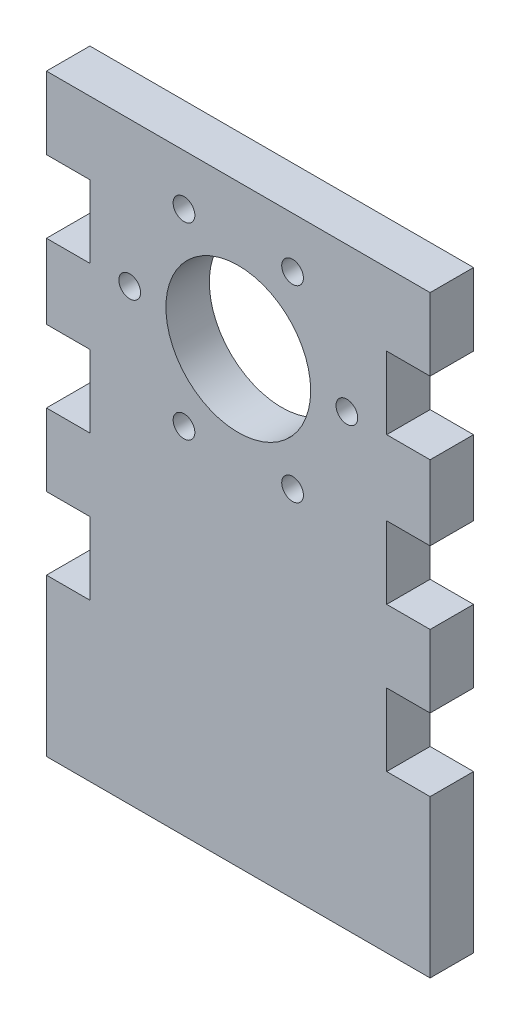
ISO-10303-21;
HEADER;
FILE_DESCRIPTION(('STEP AP214'),'2;1');
FILE_NAME('part.step','',(''),(''),'','','');
FILE_SCHEMA(('AUTOMOTIVE_DESIGN { 1 0 10303 214 1 1 1 1 }'));
ENDSEC;
DATA;
#1=APPLICATION_CONTEXT('core data for automotive mechanical design processes');
#2=APPLICATION_PROTOCOL_DEFINITION('international standard','automotive_design',2000,#1);
#3=PRODUCT_CONTEXT('',#1,'mechanical');
#4=PRODUCT('Part','Part','',(#3));
#5=PRODUCT_RELATED_PRODUCT_CATEGORY('part','',(#4));
#6=PRODUCT_DEFINITION_FORMATION('','',#4);
#7=PRODUCT_DEFINITION_CONTEXT('part definition',#1,'design');
#8=PRODUCT_DEFINITION('design','',#6,#7);
#9=PRODUCT_DEFINITION_SHAPE('','',#8);
#10=(LENGTH_UNIT() NAMED_UNIT(*) SI_UNIT(.MILLI.,.METRE.));
#11=(NAMED_UNIT(*) PLANE_ANGLE_UNIT() SI_UNIT($,.RADIAN.));
#12=(NAMED_UNIT(*) SI_UNIT($,.STERADIAN.) SOLID_ANGLE_UNIT());
#13=UNCERTAINTY_MEASURE_WITH_UNIT(LENGTH_MEASURE(1.E-05),#10,'distance_accuracy_value','');
#14=(GEOMETRIC_REPRESENTATION_CONTEXT(3) GLOBAL_UNCERTAINTY_ASSIGNED_CONTEXT((#13)) GLOBAL_UNIT_ASSIGNED_CONTEXT((#10,
#11,#12)) REPRESENTATION_CONTEXT('',''));
#15=CARTESIAN_POINT('',(0.,0.,0.));
#16=DIRECTION('',(0.,0.,1.));
#17=DIRECTION('',(1.,0.,0.));
#18=AXIS2_PLACEMENT_3D('',#15,#16,#17);
#19=CARTESIAN_POINT('',(0.,0.,3.));
#20=DIRECTION('',(0.,0.,1.));
#21=DIRECTION('',(1.,0.,0.));
#22=AXIS2_PLACEMENT_3D('',#19,#20,#21);
#23=PLANE('',#22);
#24=CARTESIAN_POINT('',(-7.49999999666401,10.5002236960238,3.));
#25=DIRECTION('',(0.,0.,1.));
#26=DIRECTION('',(1.,0.,0.));
#27=AXIS2_PLACEMENT_3D('',#24,#25,#26);
#28=CIRCLE('',#27,0.750000000000003);
#29=CARTESIAN_POINT('',(-6.749999996664,10.5002236960238,3.));
#30=VERTEX_POINT('',#29);
#31=EDGE_CURVE('E511',#30,#30,#28,.T.);
#32=ORIENTED_EDGE('',*,*,#31,.F.);
#33=EDGE_LOOP('',(#32));
#34=FACE_BOUND('',#33,.T.);
#35=CARTESIAN_POINT('',(3.75000000000002,4.00480947161672,3.));
#36=DIRECTION('',(0.,0.,1.));
#37=DIRECTION('',(1.,0.,0.));
#38=AXIS2_PLACEMENT_3D('',#35,#36,#37);
#39=CIRCLE('',#38,0.750000000000004);
#40=CARTESIAN_POINT('',(4.50000000000002,4.00480947161672,3.));
#41=VERTEX_POINT('',#40);
#42=EDGE_CURVE('E523',#41,#41,#39,.T.);
#43=ORIENTED_EDGE('',*,*,#42,.F.);
#44=EDGE_LOOP('',(#43));
#45=FACE_BOUND('',#44,.T.);
#46=CARTESIAN_POINT('',(3.75000000000001,16.9951905283833,3.));
#47=DIRECTION('',(0.,0.,1.));
#48=DIRECTION('',(1.,0.,0.));
#49=AXIS2_PLACEMENT_3D('',#46,#47,#48);
#50=CIRCLE('',#49,0.750000000000002);
#51=CARTESIAN_POINT('',(4.50000000000001,16.9951905283833,3.));
#52=VERTEX_POINT('',#51);
#53=EDGE_CURVE('E535',#52,#52,#50,.T.);
#54=ORIENTED_EDGE('',*,*,#53,.F.);
#55=EDGE_LOOP('',(#54));
#56=FACE_BOUND('',#55,.T.);
#57=DIRECTION('',(0.,1.,0.));
#58=VECTOR('',#57,1.);
#59=CARTESIAN_POINT('',(13.25,-9.65,3.));
#60=LINE('',#59,#58);
#61=CARTESIAN_POINT('',(13.25,-20.5,3.));
#62=VERTEX_POINT('',#61);
#63=CARTESIAN_POINT('',(13.25,-9.65,3.));
#64=VERTEX_POINT('',#63);
#65=EDGE_CURVE('E305',#62,#64,#60,.T.);
#66=ORIENTED_EDGE('',*,*,#65,.T.);
#67=DIRECTION('',(-1.,0.,0.));
#68=VECTOR('',#67,1.);
#69=CARTESIAN_POINT('',(10.25,-9.65000000000001,3.));
#70=LINE('',#69,#68);
#71=CARTESIAN_POINT('',(10.25,-9.65000000000001,3.));
#72=VERTEX_POINT('',#71);
#73=EDGE_CURVE('E153',#64,#72,#70,.T.);
#74=ORIENTED_EDGE('',*,*,#73,.T.);
#75=DIRECTION('',(0.,1.,0.));
#76=VECTOR('',#75,1.);
#77=CARTESIAN_POINT('',(10.25,-4.65,3.));
#78=LINE('',#77,#76);
#79=CARTESIAN_POINT('',(10.25,-4.65,3.));
#80=VERTEX_POINT('',#79);
#81=EDGE_CURVE('E380',#72,#80,#78,.T.);
#82=ORIENTED_EDGE('',*,*,#81,.T.);
#83=DIRECTION('',(1.,0.,0.));
#84=VECTOR('',#83,1.);
#85=CARTESIAN_POINT('',(13.25,-4.65,3.));
#86=LINE('',#85,#84);
#87=CARTESIAN_POINT('',(13.25,-4.65,3.));
#88=VERTEX_POINT('',#87);
#89=EDGE_CURVE('E399',#80,#88,#86,.T.);
#90=ORIENTED_EDGE('',*,*,#89,.T.);
#91=DIRECTION('',(0.,1.,0.));
#92=VECTOR('',#91,1.);
#93=CARTESIAN_POINT('',(13.25,0.349999999999997,3.));
#94=LINE('',#93,#92);
#95=CARTESIAN_POINT('',(13.25,0.349999999999997,3.));
#96=VERTEX_POINT('',#95);
#97=EDGE_CURVE('E396',#88,#96,#94,.T.);
#98=ORIENTED_EDGE('',*,*,#97,.T.);
#99=DIRECTION('',(-1.,0.,0.));
#100=VECTOR('',#99,1.);
#101=CARTESIAN_POINT('',(10.25,0.349999999999997,3.));
#102=LINE('',#101,#100);
#103=CARTESIAN_POINT('',(10.25,0.349999999999997,3.));
#104=VERTEX_POINT('',#103);
#105=EDGE_CURVE('E398',#96,#104,#102,.T.);
#106=ORIENTED_EDGE('',*,*,#105,.T.);
#107=DIRECTION('',(0.,1.,0.));
#108=VECTOR('',#107,1.);
#109=CARTESIAN_POINT('',(10.25,5.35,3.));
#110=LINE('',#109,#108);
#111=CARTESIAN_POINT('',(10.25,5.35,3.));
#112=VERTEX_POINT('',#111);
#113=EDGE_CURVE('E401',#104,#112,#110,.T.);
#114=ORIENTED_EDGE('',*,*,#113,.T.);
#115=DIRECTION('',(1.,0.,0.));
#116=VECTOR('',#115,1.);
#117=CARTESIAN_POINT('',(13.25,5.35,3.));
#118=LINE('',#117,#116);
#119=CARTESIAN_POINT('',(13.25,5.35,3.));
#120=VERTEX_POINT('',#119);
#121=EDGE_CURVE('E407',#112,#120,#118,.T.);
#122=ORIENTED_EDGE('',*,*,#121,.T.);
#123=DIRECTION('',(0.,1.,0.));
#124=VECTOR('',#123,1.);
#125=CARTESIAN_POINT('',(13.25,10.5,3.));
#126=LINE('',#125,#124);
#127=CARTESIAN_POINT('',(13.25,10.5,3.));
#128=VERTEX_POINT('',#127);
#129=EDGE_CURVE('E409',#120,#128,#126,.T.);
#130=ORIENTED_EDGE('',*,*,#129,.T.);
#131=DIRECTION('',(-1.,0.,0.));
#132=VECTOR('',#131,1.);
#133=CARTESIAN_POINT('',(10.25,10.5,3.));
#134=LINE('',#133,#132);
#135=CARTESIAN_POINT('',(10.25,10.5,3.));
#136=VERTEX_POINT('',#135);
#137=EDGE_CURVE('E411',#128,#136,#134,.T.);
#138=ORIENTED_EDGE('',*,*,#137,.T.);
#139=DIRECTION('',(0.,1.,0.));
#140=VECTOR('',#139,1.);
#141=CARTESIAN_POINT('',(10.25,15.5,3.));
#142=LINE('',#141,#140);
#143=CARTESIAN_POINT('',(10.25,15.5,3.));
#144=VERTEX_POINT('',#143);
#145=EDGE_CURVE('E413',#136,#144,#142,.T.);
#146=ORIENTED_EDGE('',*,*,#145,.T.);
#147=DIRECTION('',(1.,0.,0.));
#148=VECTOR('',#147,1.);
#149=CARTESIAN_POINT('',(13.25,15.5,3.));
#150=LINE('',#149,#148);
#151=CARTESIAN_POINT('',(13.25,15.5,3.));
#152=VERTEX_POINT('',#151);
#153=EDGE_CURVE('E415',#144,#152,#150,.T.);
#154=ORIENTED_EDGE('',*,*,#153,.T.);
#155=DIRECTION('',(0.,1.,0.));
#156=VECTOR('',#155,1.);
#157=CARTESIAN_POINT('',(13.25,20.5,3.));
#158=LINE('',#157,#156);
#159=CARTESIAN_POINT('',(13.25,20.5,3.));
#160=VERTEX_POINT('',#159);
#161=EDGE_CURVE('E417',#152,#160,#158,.T.);
#162=ORIENTED_EDGE('',*,*,#161,.T.);
#163=DIRECTION('',(-1.,0.,0.));
#164=VECTOR('',#163,1.);
#165=CARTESIAN_POINT('',(-13.25,20.5,3.));
#166=LINE('',#165,#164);
#167=CARTESIAN_POINT('',(-13.25,20.5,3.));
#168=VERTEX_POINT('',#167);
#169=EDGE_CURVE('E419',#160,#168,#166,.T.);
#170=ORIENTED_EDGE('',*,*,#169,.T.);
#171=DIRECTION('',(0.,-1.,0.));
#172=VECTOR('',#171,1.);
#173=CARTESIAN_POINT('',(-13.25,20.5,3.));
#174=LINE('',#173,#172);
#175=CARTESIAN_POINT('',(-13.25,15.5,3.));
#176=VERTEX_POINT('',#175);
#177=EDGE_CURVE('E421',#168,#176,#174,.T.);
#178=ORIENTED_EDGE('',*,*,#177,.T.);
#179=DIRECTION('',(1.,0.,0.));
#180=VECTOR('',#179,1.);
#181=CARTESIAN_POINT('',(-13.25,15.5,3.));
#182=LINE('',#181,#180);
#183=CARTESIAN_POINT('',(-10.25,15.5,3.));
#184=VERTEX_POINT('',#183);
#185=EDGE_CURVE('E423',#176,#184,#182,.T.);
#186=ORIENTED_EDGE('',*,*,#185,.T.);
#187=DIRECTION('',(0.,-1.,0.));
#188=VECTOR('',#187,1.);
#189=CARTESIAN_POINT('',(-10.25,15.5,3.));
#190=LINE('',#189,#188);
#191=CARTESIAN_POINT('',(-10.25,10.5,3.));
#192=VERTEX_POINT('',#191);
#193=EDGE_CURVE('E425',#184,#192,#190,.T.);
#194=ORIENTED_EDGE('',*,*,#193,.T.);
#195=DIRECTION('',(-1.,0.,0.));
#196=VECTOR('',#195,1.);
#197=CARTESIAN_POINT('',(-10.25,10.5,3.));
#198=LINE('',#197,#196);
#199=CARTESIAN_POINT('',(-13.25,10.5,3.));
#200=VERTEX_POINT('',#199);
#201=EDGE_CURVE('E427',#192,#200,#198,.T.);
#202=ORIENTED_EDGE('',*,*,#201,.T.);
#203=DIRECTION('',(0.,-1.,0.));
#204=VECTOR('',#203,1.);
#205=CARTESIAN_POINT('',(-13.25,10.5,3.));
#206=LINE('',#205,#204);
#207=CARTESIAN_POINT('',(-13.25,5.35,3.));
#208=VERTEX_POINT('',#207);
#209=EDGE_CURVE('E429',#200,#208,#206,.T.);
#210=ORIENTED_EDGE('',*,*,#209,.T.);
#211=DIRECTION('',(1.,0.,0.));
#212=VECTOR('',#211,1.);
#213=CARTESIAN_POINT('',(-13.25,5.35,3.));
#214=LINE('',#213,#212);
#215=CARTESIAN_POINT('',(-10.25,5.35,3.));
#216=VERTEX_POINT('',#215);
#217=EDGE_CURVE('E431',#208,#216,#214,.T.);
#218=ORIENTED_EDGE('',*,*,#217,.T.);
#219=DIRECTION('',(0.,-1.,0.));
#220=VECTOR('',#219,1.);
#221=CARTESIAN_POINT('',(-10.25,5.35,3.));
#222=LINE('',#221,#220);
#223=CARTESIAN_POINT('',(-10.25,0.349999999999994,3.));
#224=VERTEX_POINT('',#223);
#225=EDGE_CURVE('E433',#216,#224,#222,.T.);
#226=ORIENTED_EDGE('',*,*,#225,.T.);
#227=DIRECTION('',(-1.,0.,0.));
#228=VECTOR('',#227,1.);
#229=CARTESIAN_POINT('',(-10.25,0.349999999999994,3.));
#230=LINE('',#229,#228);
#231=CARTESIAN_POINT('',(-13.25,0.349999999999994,3.));
#232=VERTEX_POINT('',#231);
#233=EDGE_CURVE('E435',#224,#232,#230,.T.);
#234=ORIENTED_EDGE('',*,*,#233,.T.);
#235=DIRECTION('',(0.,-1.,0.));
#236=VECTOR('',#235,1.);
#237=CARTESIAN_POINT('',(-13.25,0.349999999999994,3.));
#238=LINE('',#237,#236);
#239=CARTESIAN_POINT('',(-13.25,-4.65000000000001,3.));
#240=VERTEX_POINT('',#239);
#241=EDGE_CURVE('E437',#232,#240,#238,.T.);
#242=ORIENTED_EDGE('',*,*,#241,.T.);
#243=DIRECTION('',(1.,0.,0.));
#244=VECTOR('',#243,1.);
#245=CARTESIAN_POINT('',(-13.25,-4.65000000000001,3.));
#246=LINE('',#245,#244);
#247=CARTESIAN_POINT('',(-10.25,-4.65000000000001,3.));
#248=VERTEX_POINT('',#247);
#249=EDGE_CURVE('E439',#240,#248,#246,.T.);
#250=ORIENTED_EDGE('',*,*,#249,.T.);
#251=DIRECTION('',(0.,-1.,0.));
#252=VECTOR('',#251,1.);
#253=CARTESIAN_POINT('',(-10.25,-4.65000000000001,3.));
#254=LINE('',#253,#252);
#255=CARTESIAN_POINT('',(-10.25,-9.65000000000001,3.));
#256=VERTEX_POINT('',#255);
#257=EDGE_CURVE('E232',#248,#256,#254,.T.);
#258=ORIENTED_EDGE('',*,*,#257,.T.);
#259=DIRECTION('',(-1.,0.,0.));
#260=VECTOR('',#259,1.);
#261=CARTESIAN_POINT('',(-10.25,-9.65000000000001,3.));
#262=LINE('',#261,#260);
#263=CARTESIAN_POINT('',(-13.25,-9.65000000000001,3.));
#264=VERTEX_POINT('',#263);
#265=EDGE_CURVE('E226',#256,#264,#262,.T.);
#266=ORIENTED_EDGE('',*,*,#265,.T.);
#267=DIRECTION('',(0.,-1.,0.));
#268=VECTOR('',#267,1.);
#269=CARTESIAN_POINT('',(-13.25,-9.65000000000001,3.));
#270=LINE('',#269,#268);
#271=CARTESIAN_POINT('',(-13.25,-20.5,3.));
#272=VERTEX_POINT('',#271);
#273=EDGE_CURVE('E230',#264,#272,#270,.T.);
#274=ORIENTED_EDGE('',*,*,#273,.T.);
#275=DIRECTION('',(1.,0.,0.));
#276=VECTOR('',#275,1.);
#277=CARTESIAN_POINT('',(-13.25,-20.5,3.));
#278=LINE('',#277,#276);
#279=EDGE_CURVE('E50',#272,#62,#278,.T.);
#280=ORIENTED_EDGE('',*,*,#279,.T.);
#281=EDGE_LOOP('',(#66,#74,#82,#90,#98,#106,#114,#122,#130,#138,#146,#154,#162,#170,#178,#186,
#194,#202,#210,#218,#226,#234,#242,#250,#258,#266,#274,#280));
#282=FACE_BOUND('',#281,.T.);
#283=CARTESIAN_POINT('',(0.,10.5,3.));
#284=DIRECTION('',(0.,0.,1.));
#285=DIRECTION('',(1.,0.,0.));
#286=AXIS2_PLACEMENT_3D('',#283,#284,#285);
#287=CIRCLE('',#286,5.);
#288=CARTESIAN_POINT('',(5.,10.5,3.));
#289=VERTEX_POINT('',#288);
#290=EDGE_CURVE('E254',#289,#289,#287,.T.);
#291=ORIENTED_EDGE('',*,*,#290,.F.);
#292=EDGE_LOOP('',(#291));
#293=FACE_BOUND('',#292,.T.);
#294=CARTESIAN_POINT('',(7.49999999666401,10.4997763039762,3.));
#295=DIRECTION('',(0.,0.,1.));
#296=DIRECTION('',(1.,0.,0.));
#297=AXIS2_PLACEMENT_3D('',#294,#295,#296);
#298=CIRCLE('',#297,0.75);
#299=CARTESIAN_POINT('',(8.24999999666401,10.4997763039762,3.));
#300=VERTEX_POINT('',#299);
#301=EDGE_CURVE('E529',#300,#300,#298,.T.);
#302=ORIENTED_EDGE('',*,*,#301,.F.);
#303=EDGE_LOOP('',(#302));
#304=FACE_BOUND('',#303,.T.);
#305=CARTESIAN_POINT('',(-3.75,4.00480947161671,3.));
#306=DIRECTION('',(0.,0.,1.));
#307=DIRECTION('',(1.,0.,0.));
#308=AXIS2_PLACEMENT_3D('',#305,#306,#307);
#309=CIRCLE('',#308,0.750000000000003);
#310=CARTESIAN_POINT('',(-3.,4.00480947161671,3.));
#311=VERTEX_POINT('',#310);
#312=EDGE_CURVE('E517',#311,#311,#309,.T.);
#313=ORIENTED_EDGE('',*,*,#312,.F.);
#314=EDGE_LOOP('',(#313));
#315=FACE_BOUND('',#314,.T.);
#316=CARTESIAN_POINT('',(-3.75000000000001,16.9951905283833,3.));
#317=DIRECTION('',(0.,0.,1.));
#318=DIRECTION('',(1.,0.,0.));
#319=AXIS2_PLACEMENT_3D('',#316,#317,#318);
#320=CIRCLE('',#319,0.750000000000002);
#321=CARTESIAN_POINT('',(-3.,16.9951905283833,3.));
#322=VERTEX_POINT('',#321);
#323=EDGE_CURVE('E502',#322,#322,#320,.T.);
#324=ORIENTED_EDGE('',*,*,#323,.F.);
#325=EDGE_LOOP('',(#324));
#326=FACE_BOUND('',#325,.T.);
#327=ADVANCED_FACE('F33',(#34,#45,#56,#282,#293,#304,#315,#326),#23,.T.);
#328=CARTESIAN_POINT('',(0.,0.,0.));
#329=DIRECTION('',(0.,0.,1.));
#330=DIRECTION('',(1.,0.,0.));
#331=AXIS2_PLACEMENT_3D('',#328,#329,#330);
#332=PLANE('',#331);
#333=DIRECTION('',(0.,1.,0.));
#334=VECTOR('',#333,1.);
#335=CARTESIAN_POINT('',(13.25,-9.65,0.));
#336=LINE('',#335,#334);
#337=CARTESIAN_POINT('',(13.25,-20.5,0.));
#338=VERTEX_POINT('',#337);
#339=CARTESIAN_POINT('',(13.25,-9.65,0.));
#340=VERTEX_POINT('',#339);
#341=EDGE_CURVE('E250',#338,#340,#336,.T.);
#342=ORIENTED_EDGE('',*,*,#341,.F.);
#343=DIRECTION('',(1.,0.,0.));
#344=VECTOR('',#343,1.);
#345=CARTESIAN_POINT('',(-13.25,-20.5,0.));
#346=LINE('',#345,#344);
#347=CARTESIAN_POINT('',(-13.25,-20.5,0.));
#348=VERTEX_POINT('',#347);
#349=EDGE_CURVE('E145',#348,#338,#346,.T.);
#350=ORIENTED_EDGE('',*,*,#349,.F.);
#351=DIRECTION('',(0.,-1.,0.));
#352=VECTOR('',#351,1.);
#353=CARTESIAN_POINT('',(-13.25,-9.65000000000001,0.));
#354=LINE('',#353,#352);
#355=CARTESIAN_POINT('',(-13.25,-9.65000000000001,0.));
#356=VERTEX_POINT('',#355);
#357=EDGE_CURVE('E139',#356,#348,#354,.T.);
#358=ORIENTED_EDGE('',*,*,#357,.F.);
#359=DIRECTION('',(-1.,0.,0.));
#360=VECTOR('',#359,1.);
#361=CARTESIAN_POINT('',(-10.25,-9.65000000000001,0.));
#362=LINE('',#361,#360);
#363=CARTESIAN_POINT('',(-10.25,-9.65000000000001,0.));
#364=VERTEX_POINT('',#363);
#365=EDGE_CURVE('E240',#364,#356,#362,.T.);
#366=ORIENTED_EDGE('',*,*,#365,.F.);
#367=DIRECTION('',(0.,-1.,0.));
#368=VECTOR('',#367,1.);
#369=CARTESIAN_POINT('',(-10.25,-4.65000000000001,0.));
#370=LINE('',#369,#368);
#371=CARTESIAN_POINT('',(-10.25,-4.65000000000001,0.));
#372=VERTEX_POINT('',#371);
#373=EDGE_CURVE('E300',#372,#364,#370,.T.);
#374=ORIENTED_EDGE('',*,*,#373,.F.);
#375=DIRECTION('',(1.,0.,0.));
#376=VECTOR('',#375,1.);
#377=CARTESIAN_POINT('',(-13.25,-4.65000000000001,0.));
#378=LINE('',#377,#376);
#379=CARTESIAN_POINT('',(-13.25,-4.65000000000001,0.));
#380=VERTEX_POINT('',#379);
#381=EDGE_CURVE('E298',#380,#372,#378,.T.);
#382=ORIENTED_EDGE('',*,*,#381,.F.);
#383=DIRECTION('',(0.,-1.,0.));
#384=VECTOR('',#383,1.);
#385=CARTESIAN_POINT('',(-13.25,0.349999999999994,0.));
#386=LINE('',#385,#384);
#387=CARTESIAN_POINT('',(-13.25,0.349999999999994,0.));
#388=VERTEX_POINT('',#387);
#389=EDGE_CURVE('E296',#388,#380,#386,.T.);
#390=ORIENTED_EDGE('',*,*,#389,.F.);
#391=DIRECTION('',(-1.,0.,0.));
#392=VECTOR('',#391,1.);
#393=CARTESIAN_POINT('',(-10.25,0.349999999999994,0.));
#394=LINE('',#393,#392);
#395=CARTESIAN_POINT('',(-10.25,0.349999999999994,0.));
#396=VERTEX_POINT('',#395);
#397=EDGE_CURVE('E294',#396,#388,#394,.T.);
#398=ORIENTED_EDGE('',*,*,#397,.F.);
#399=DIRECTION('',(0.,-1.,0.));
#400=VECTOR('',#399,1.);
#401=CARTESIAN_POINT('',(-10.25,5.35,0.));
#402=LINE('',#401,#400);
#403=CARTESIAN_POINT('',(-10.25,5.35,0.));
#404=VERTEX_POINT('',#403);
#405=EDGE_CURVE('E292',#404,#396,#402,.T.);
#406=ORIENTED_EDGE('',*,*,#405,.F.);
#407=DIRECTION('',(1.,0.,0.));
#408=VECTOR('',#407,1.);
#409=CARTESIAN_POINT('',(-13.25,5.35,0.));
#410=LINE('',#409,#408);
#411=CARTESIAN_POINT('',(-13.25,5.35,0.));
#412=VERTEX_POINT('',#411);
#413=EDGE_CURVE('E290',#412,#404,#410,.T.);
#414=ORIENTED_EDGE('',*,*,#413,.F.);
#415=DIRECTION('',(0.,-1.,0.));
#416=VECTOR('',#415,1.);
#417=CARTESIAN_POINT('',(-13.25,10.5,0.));
#418=LINE('',#417,#416);
#419=CARTESIAN_POINT('',(-13.25,10.5,0.));
#420=VERTEX_POINT('',#419);
#421=EDGE_CURVE('E288',#420,#412,#418,.T.);
#422=ORIENTED_EDGE('',*,*,#421,.F.);
#423=DIRECTION('',(-1.,0.,0.));
#424=VECTOR('',#423,1.);
#425=CARTESIAN_POINT('',(-10.25,10.5,0.));
#426=LINE('',#425,#424);
#427=CARTESIAN_POINT('',(-10.25,10.5,0.));
#428=VERTEX_POINT('',#427);
#429=EDGE_CURVE('E286',#428,#420,#426,.T.);
#430=ORIENTED_EDGE('',*,*,#429,.F.);
#431=DIRECTION('',(0.,-1.,0.));
#432=VECTOR('',#431,1.);
#433=CARTESIAN_POINT('',(-10.25,15.5,0.));
#434=LINE('',#433,#432);
#435=CARTESIAN_POINT('',(-10.25,15.5,0.));
#436=VERTEX_POINT('',#435);
#437=EDGE_CURVE('E284',#436,#428,#434,.T.);
#438=ORIENTED_EDGE('',*,*,#437,.F.);
#439=DIRECTION('',(1.,0.,0.));
#440=VECTOR('',#439,1.);
#441=CARTESIAN_POINT('',(-13.25,15.5,0.));
#442=LINE('',#441,#440);
#443=CARTESIAN_POINT('',(-13.25,15.5,0.));
#444=VERTEX_POINT('',#443);
#445=EDGE_CURVE('E282',#444,#436,#442,.T.);
#446=ORIENTED_EDGE('',*,*,#445,.F.);
#447=DIRECTION('',(0.,-1.,0.));
#448=VECTOR('',#447,1.);
#449=CARTESIAN_POINT('',(-13.25,20.5,0.));
#450=LINE('',#449,#448);
#451=CARTESIAN_POINT('',(-13.25,20.5,0.));
#452=VERTEX_POINT('',#451);
#453=EDGE_CURVE('E280',#452,#444,#450,.T.);
#454=ORIENTED_EDGE('',*,*,#453,.F.);
#455=DIRECTION('',(-1.,0.,0.));
#456=VECTOR('',#455,1.);
#457=CARTESIAN_POINT('',(-13.25,20.5,0.));
#458=LINE('',#457,#456);
#459=CARTESIAN_POINT('',(13.25,20.5,0.));
#460=VERTEX_POINT('',#459);
#461=EDGE_CURVE('E278',#460,#452,#458,.T.);
#462=ORIENTED_EDGE('',*,*,#461,.F.);
#463=DIRECTION('',(0.,1.,0.));
#464=VECTOR('',#463,1.);
#465=CARTESIAN_POINT('',(13.25,20.5,0.));
#466=LINE('',#465,#464);
#467=CARTESIAN_POINT('',(13.25,15.5,0.));
#468=VERTEX_POINT('',#467);
#469=EDGE_CURVE('E276',#468,#460,#466,.T.);
#470=ORIENTED_EDGE('',*,*,#469,.F.);
#471=DIRECTION('',(1.,0.,0.));
#472=VECTOR('',#471,1.);
#473=CARTESIAN_POINT('',(13.25,15.5,0.));
#474=LINE('',#473,#472);
#475=CARTESIAN_POINT('',(10.25,15.5,0.));
#476=VERTEX_POINT('',#475);
#477=EDGE_CURVE('E274',#476,#468,#474,.T.);
#478=ORIENTED_EDGE('',*,*,#477,.F.);
#479=DIRECTION('',(0.,1.,0.));
#480=VECTOR('',#479,1.);
#481=CARTESIAN_POINT('',(10.25,15.5,0.));
#482=LINE('',#481,#480);
#483=CARTESIAN_POINT('',(10.25,10.5,0.));
#484=VERTEX_POINT('',#483);
#485=EDGE_CURVE('E272',#484,#476,#482,.T.);
#486=ORIENTED_EDGE('',*,*,#485,.F.);
#487=DIRECTION('',(-1.,0.,0.));
#488=VECTOR('',#487,1.);
#489=CARTESIAN_POINT('',(10.25,10.5,0.));
#490=LINE('',#489,#488);
#491=CARTESIAN_POINT('',(13.25,10.5,0.));
#492=VERTEX_POINT('',#491);
#493=EDGE_CURVE('E270',#492,#484,#490,.T.);
#494=ORIENTED_EDGE('',*,*,#493,.F.);
#495=DIRECTION('',(0.,1.,0.));
#496=VECTOR('',#495,1.);
#497=CARTESIAN_POINT('',(13.25,10.5,0.));
#498=LINE('',#497,#496);
#499=CARTESIAN_POINT('',(13.25,5.35,0.));
#500=VERTEX_POINT('',#499);
#501=EDGE_CURVE('E268',#500,#492,#498,.T.);
#502=ORIENTED_EDGE('',*,*,#501,.F.);
#503=DIRECTION('',(1.,0.,0.));
#504=VECTOR('',#503,1.);
#505=CARTESIAN_POINT('',(13.25,5.35,0.));
#506=LINE('',#505,#504);
#507=CARTESIAN_POINT('',(10.25,5.35,0.));
#508=VERTEX_POINT('',#507);
#509=EDGE_CURVE('E266',#508,#500,#506,.T.);
#510=ORIENTED_EDGE('',*,*,#509,.F.);
#511=DIRECTION('',(0.,1.,0.));
#512=VECTOR('',#511,1.);
#513=CARTESIAN_POINT('',(10.25,5.35,0.));
#514=LINE('',#513,#512);
#515=CARTESIAN_POINT('',(10.25,0.349999999999997,0.));
#516=VERTEX_POINT('',#515);
#517=EDGE_CURVE('E264',#516,#508,#514,.T.);
#518=ORIENTED_EDGE('',*,*,#517,.F.);
#519=DIRECTION('',(-1.,0.,0.));
#520=VECTOR('',#519,1.);
#521=CARTESIAN_POINT('',(10.25,0.349999999999997,0.));
#522=LINE('',#521,#520);
#523=CARTESIAN_POINT('',(13.25,0.349999999999997,0.));
#524=VERTEX_POINT('',#523);
#525=EDGE_CURVE('E262',#524,#516,#522,.T.);
#526=ORIENTED_EDGE('',*,*,#525,.F.);
#527=DIRECTION('',(0.,1.,0.));
#528=VECTOR('',#527,1.);
#529=CARTESIAN_POINT('',(13.25,0.349999999999997,0.));
#530=LINE('',#529,#528);
#531=CARTESIAN_POINT('',(13.25,-4.65,0.));
#532=VERTEX_POINT('',#531);
#533=EDGE_CURVE('E260',#532,#524,#530,.T.);
#534=ORIENTED_EDGE('',*,*,#533,.F.);
#535=DIRECTION('',(1.,0.,0.));
#536=VECTOR('',#535,1.);
#537=CARTESIAN_POINT('',(13.25,-4.65,0.));
#538=LINE('',#537,#536);
#539=CARTESIAN_POINT('',(10.25,-4.65,0.));
#540=VERTEX_POINT('',#539);
#541=EDGE_CURVE('E258',#540,#532,#538,.T.);
#542=ORIENTED_EDGE('',*,*,#541,.F.);
#543=DIRECTION('',(0.,1.,0.));
#544=VECTOR('',#543,1.);
#545=CARTESIAN_POINT('',(10.25,-4.65,0.));
#546=LINE('',#545,#544);
#547=CARTESIAN_POINT('',(10.25,-9.65000000000001,0.));
#548=VERTEX_POINT('',#547);
#549=EDGE_CURVE('E256',#548,#540,#546,.T.);
#550=ORIENTED_EDGE('',*,*,#549,.F.);
#551=DIRECTION('',(-1.,0.,0.));
#552=VECTOR('',#551,1.);
#553=CARTESIAN_POINT('',(10.25,-9.65000000000001,0.));
#554=LINE('',#553,#552);
#555=EDGE_CURVE('E253',#340,#548,#554,.T.);
#556=ORIENTED_EDGE('',*,*,#555,.F.);
#557=EDGE_LOOP('',(#342,#350,#358,#366,#374,#382,#390,#398,#406,#414,#422,#430,#438,#446,#454,
#462,#470,#478,#486,#494,#502,#510,#518,#526,#534,#542,#550,#556));
#558=FACE_BOUND('',#557,.T.);
#559=CARTESIAN_POINT('',(0.,10.5,0.));
#560=DIRECTION('',(0.,0.,1.));
#561=DIRECTION('',(1.,0.,0.));
#562=AXIS2_PLACEMENT_3D('',#559,#560,#561);
#563=CIRCLE('',#562,5.);
#564=CARTESIAN_POINT('',(5.,10.5,0.));
#565=VERTEX_POINT('',#564);
#566=EDGE_CURVE('E538',#565,#565,#563,.T.);
#567=ORIENTED_EDGE('',*,*,#566,.T.);
#568=EDGE_LOOP('',(#567));
#569=FACE_BOUND('',#568,.T.);
#570=CARTESIAN_POINT('',(3.75000000000001,16.9951905283833,0.));
#571=DIRECTION('',(0.,0.,1.));
#572=DIRECTION('',(1.,0.,0.));
#573=AXIS2_PLACEMENT_3D('',#570,#571,#572);
#574=CIRCLE('',#573,0.750000000000002);
#575=CARTESIAN_POINT('',(4.50000000000001,16.9951905283833,0.));
#576=VERTEX_POINT('',#575);
#577=EDGE_CURVE('E532',#576,#576,#574,.T.);
#578=ORIENTED_EDGE('',*,*,#577,.T.);
#579=EDGE_LOOP('',(#578));
#580=FACE_BOUND('',#579,.T.);
#581=CARTESIAN_POINT('',(7.49999999666401,10.4997763039762,0.));
#582=DIRECTION('',(0.,0.,1.));
#583=DIRECTION('',(1.,0.,0.));
#584=AXIS2_PLACEMENT_3D('',#581,#582,#583);
#585=CIRCLE('',#584,0.75);
#586=CARTESIAN_POINT('',(8.24999999666401,10.4997763039762,0.));
#587=VERTEX_POINT('',#586);
#588=EDGE_CURVE('E526',#587,#587,#585,.T.);
#589=ORIENTED_EDGE('',*,*,#588,.T.);
#590=EDGE_LOOP('',(#589));
#591=FACE_BOUND('',#590,.T.);
#592=CARTESIAN_POINT('',(3.75000000000002,4.00480947161672,0.));
#593=DIRECTION('',(0.,0.,1.));
#594=DIRECTION('',(1.,0.,0.));
#595=AXIS2_PLACEMENT_3D('',#592,#593,#594);
#596=CIRCLE('',#595,0.750000000000004);
#597=CARTESIAN_POINT('',(4.50000000000002,4.00480947161672,0.));
#598=VERTEX_POINT('',#597);
#599=EDGE_CURVE('E520',#598,#598,#596,.T.);
#600=ORIENTED_EDGE('',*,*,#599,.T.);
#601=EDGE_LOOP('',(#600));
#602=FACE_BOUND('',#601,.T.);
#603=CARTESIAN_POINT('',(-3.75,4.00480947161671,0.));
#604=DIRECTION('',(0.,0.,1.));
#605=DIRECTION('',(1.,0.,0.));
#606=AXIS2_PLACEMENT_3D('',#603,#604,#605);
#607=CIRCLE('',#606,0.750000000000003);
#608=CARTESIAN_POINT('',(-3.,4.00480947161671,0.));
#609=VERTEX_POINT('',#608);
#610=EDGE_CURVE('E514',#609,#609,#607,.T.);
#611=ORIENTED_EDGE('',*,*,#610,.T.);
#612=EDGE_LOOP('',(#611));
#613=FACE_BOUND('',#612,.T.);
#614=CARTESIAN_POINT('',(-7.49999999666401,10.5002236960238,0.));
#615=DIRECTION('',(0.,0.,1.));
#616=DIRECTION('',(1.,0.,0.));
#617=AXIS2_PLACEMENT_3D('',#614,#615,#616);
#618=CIRCLE('',#617,0.750000000000003);
#619=CARTESIAN_POINT('',(-6.749999996664,10.5002236960238,0.));
#620=VERTEX_POINT('',#619);
#621=EDGE_CURVE('E508',#620,#620,#618,.T.);
#622=ORIENTED_EDGE('',*,*,#621,.T.);
#623=EDGE_LOOP('',(#622));
#624=FACE_BOUND('',#623,.T.);
#625=CARTESIAN_POINT('',(-3.75000000000001,16.9951905283833,0.));
#626=DIRECTION('',(0.,0.,1.));
#627=DIRECTION('',(1.,0.,0.));
#628=AXIS2_PLACEMENT_3D('',#625,#626,#627);
#629=CIRCLE('',#628,0.750000000000002);
#630=CARTESIAN_POINT('',(-3.,16.9951905283833,0.));
#631=VERTEX_POINT('',#630);
#632=EDGE_CURVE('E505',#631,#631,#629,.T.);
#633=ORIENTED_EDGE('',*,*,#632,.T.);
#634=EDGE_LOOP('',(#633));
#635=FACE_BOUND('',#634,.T.);
#636=ADVANCED_FACE('F384',(#558,#569,#580,#591,#602,#613,#624,#635),#332,.F.);
#637=CARTESIAN_POINT('',(13.25,-9.65,3.));
#638=DIRECTION('',(-1.,0.,0.));
#639=DIRECTION('',(0.,0.,1.));
#640=AXIS2_PLACEMENT_3D('',#637,#638,#639);
#641=PLANE('',#640);
#642=ORIENTED_EDGE('',*,*,#341,.T.);
#643=DIRECTION('',(0.,0.,-1.));
#644=VECTOR('',#643,1.);
#645=CARTESIAN_POINT('',(13.25,-9.65,3.));
#646=LINE('',#645,#644);
#647=EDGE_CURVE('E11',#64,#340,#646,.T.);
#648=ORIENTED_EDGE('',*,*,#647,.F.);
#649=ORIENTED_EDGE('',*,*,#65,.F.);
#650=DIRECTION('',(0.,0.,-1.));
#651=VECTOR('',#650,1.);
#652=CARTESIAN_POINT('',(13.25,-20.5,3.));
#653=LINE('',#652,#651);
#654=EDGE_CURVE('E246',#62,#338,#653,.T.);
#655=ORIENTED_EDGE('',*,*,#654,.T.);
#656=EDGE_LOOP('',(#642,#648,#649,#655));
#657=FACE_BOUND('',#656,.T.);
#658=ADVANCED_FACE('F35',(#657),#641,.F.);
#659=CARTESIAN_POINT('',(10.25,-9.65000000000001,3.));
#660=DIRECTION('',(0.,-1.,0.));
#661=DIRECTION('',(1.,0.,0.));
#662=AXIS2_PLACEMENT_3D('',#659,#660,#661);
#663=PLANE('',#662);
#664=ORIENTED_EDGE('',*,*,#555,.T.);
#665=DIRECTION('',(0.,0.,-1.));
#666=VECTOR('',#665,1.);
#667=CARTESIAN_POINT('',(10.25,-9.65000000000001,3.));
#668=LINE('',#667,#666);
#669=EDGE_CURVE('E42',#72,#548,#668,.T.);
#670=ORIENTED_EDGE('',*,*,#669,.F.);
#671=ORIENTED_EDGE('',*,*,#73,.F.);
#672=ORIENTED_EDGE('',*,*,#647,.T.);
#673=EDGE_LOOP('',(#664,#670,#671,#672));
#674=FACE_BOUND('',#673,.T.);
#675=ADVANCED_FACE('F835',(#674),#663,.F.);
#676=CARTESIAN_POINT('',(10.25,-4.65,3.));
#677=DIRECTION('',(-1.,0.,0.));
#678=DIRECTION('',(0.,0.,1.));
#679=AXIS2_PLACEMENT_3D('',#676,#677,#678);
#680=PLANE('',#679);
#681=ORIENTED_EDGE('',*,*,#549,.T.);
#682=DIRECTION('',(0.,0.,-1.));
#683=VECTOR('',#682,1.);
#684=CARTESIAN_POINT('',(10.25,-4.65,3.));
#685=LINE('',#684,#683);
#686=EDGE_CURVE('E372',#80,#540,#685,.T.);
#687=ORIENTED_EDGE('',*,*,#686,.F.);
#688=ORIENTED_EDGE('',*,*,#81,.F.);
#689=ORIENTED_EDGE('',*,*,#669,.T.);
#690=EDGE_LOOP('',(#681,#687,#688,#689));
#691=FACE_BOUND('',#690,.T.);
#692=ADVANCED_FACE('F378',(#691),#680,.F.);
#693=CARTESIAN_POINT('',(13.25,-4.65,3.));
#694=DIRECTION('',(0.,1.,0.));
#695=DIRECTION('',(-1.,0.,0.));
#696=AXIS2_PLACEMENT_3D('',#693,#694,#695);
#697=PLANE('',#696);
#698=ORIENTED_EDGE('',*,*,#541,.T.);
#699=DIRECTION('',(0.,0.,-1.));
#700=VECTOR('',#699,1.);
#701=CARTESIAN_POINT('',(13.25,-4.65,3.));
#702=LINE('',#701,#700);
#703=EDGE_CURVE('E369',#88,#532,#702,.T.);
#704=ORIENTED_EDGE('',*,*,#703,.F.);
#705=ORIENTED_EDGE('',*,*,#89,.F.);
#706=ORIENTED_EDGE('',*,*,#686,.T.);
#707=EDGE_LOOP('',(#698,#704,#705,#706));
#708=FACE_BOUND('',#707,.T.);
#709=ADVANCED_FACE('F390',(#708),#697,.F.);
#710=CARTESIAN_POINT('',(13.25,0.349999999999997,3.));
#711=DIRECTION('',(-1.,0.,0.));
#712=DIRECTION('',(0.,-1.,0.));
#713=AXIS2_PLACEMENT_3D('',#710,#711,#712);
#714=PLANE('',#713);
#715=ORIENTED_EDGE('',*,*,#533,.T.);
#716=DIRECTION('',(0.,0.,-1.));
#717=VECTOR('',#716,1.);
#718=CARTESIAN_POINT('',(13.25,0.349999999999997,3.));
#719=LINE('',#718,#717);
#720=EDGE_CURVE('E366',#96,#524,#719,.T.);
#721=ORIENTED_EDGE('',*,*,#720,.F.);
#722=ORIENTED_EDGE('',*,*,#97,.F.);
#723=ORIENTED_EDGE('',*,*,#703,.T.);
#724=EDGE_LOOP('',(#715,#721,#722,#723));
#725=FACE_BOUND('',#724,.T.);
#726=ADVANCED_FACE('F394',(#725),#714,.F.);
#727=CARTESIAN_POINT('',(10.25,0.349999999999997,3.));
#728=DIRECTION('',(0.,-1.,0.));
#729=DIRECTION('',(1.,0.,0.));
#730=AXIS2_PLACEMENT_3D('',#727,#728,#729);
#731=PLANE('',#730);
#732=ORIENTED_EDGE('',*,*,#525,.T.);
#733=DIRECTION('',(0.,0.,-1.));
#734=VECTOR('',#733,1.);
#735=CARTESIAN_POINT('',(10.25,0.349999999999997,3.));
#736=LINE('',#735,#734);
#737=EDGE_CURVE('E363',#104,#516,#736,.T.);
#738=ORIENTED_EDGE('',*,*,#737,.F.);
#739=ORIENTED_EDGE('',*,*,#105,.F.);
#740=ORIENTED_EDGE('',*,*,#720,.T.);
#741=EDGE_LOOP('',(#732,#738,#739,#740));
#742=FACE_BOUND('',#741,.T.);
#743=ADVANCED_FACE('F800',(#742),#731,.F.);
#744=CARTESIAN_POINT('',(10.25,5.35,3.));
#745=DIRECTION('',(-1.,0.,0.));
#746=DIRECTION('',(0.,-1.,0.));
#747=AXIS2_PLACEMENT_3D('',#744,#745,#746);
#748=PLANE('',#747);
#749=ORIENTED_EDGE('',*,*,#517,.T.);
#750=DIRECTION('',(0.,0.,-1.));
#751=VECTOR('',#750,1.);
#752=CARTESIAN_POINT('',(10.25,5.35,3.));
#753=LINE('',#752,#751);
#754=EDGE_CURVE('E360',#112,#508,#753,.T.);
#755=ORIENTED_EDGE('',*,*,#754,.F.);
#756=ORIENTED_EDGE('',*,*,#113,.F.);
#757=ORIENTED_EDGE('',*,*,#737,.T.);
#758=EDGE_LOOP('',(#749,#755,#756,#757));
#759=FACE_BOUND('',#758,.T.);
#760=ADVANCED_FACE('F790',(#759),#748,.F.);
#761=CARTESIAN_POINT('',(13.25,5.35,3.));
#762=DIRECTION('',(0.,1.,0.));
#763=DIRECTION('',(-1.,0.,0.));
#764=AXIS2_PLACEMENT_3D('',#761,#762,#763);
#765=PLANE('',#764);
#766=ORIENTED_EDGE('',*,*,#509,.T.);
#767=DIRECTION('',(0.,0.,-1.));
#768=VECTOR('',#767,1.);
#769=CARTESIAN_POINT('',(13.25,5.35,3.));
#770=LINE('',#769,#768);
#771=EDGE_CURVE('E357',#120,#500,#770,.T.);
#772=ORIENTED_EDGE('',*,*,#771,.F.);
#773=ORIENTED_EDGE('',*,*,#121,.F.);
#774=ORIENTED_EDGE('',*,*,#754,.T.);
#775=EDGE_LOOP('',(#766,#772,#773,#774));
#776=FACE_BOUND('',#775,.T.);
#777=ADVANCED_FACE('F780',(#776),#765,.F.);
#778=CARTESIAN_POINT('',(13.25,10.5,3.));
#779=DIRECTION('',(-1.,0.,0.));
#780=DIRECTION('',(0.,0.,1.));
#781=AXIS2_PLACEMENT_3D('',#778,#779,#780);
#782=PLANE('',#781);
#783=ORIENTED_EDGE('',*,*,#501,.T.);
#784=DIRECTION('',(0.,0.,-1.));
#785=VECTOR('',#784,1.);
#786=CARTESIAN_POINT('',(13.25,10.5,3.));
#787=LINE('',#786,#785);
#788=EDGE_CURVE('E354',#128,#492,#787,.T.);
#789=ORIENTED_EDGE('',*,*,#788,.F.);
#790=ORIENTED_EDGE('',*,*,#129,.F.);
#791=ORIENTED_EDGE('',*,*,#771,.T.);
#792=EDGE_LOOP('',(#783,#789,#790,#791));
#793=FACE_BOUND('',#792,.T.);
#794=ADVANCED_FACE('F770',(#793),#782,.F.);
#795=CARTESIAN_POINT('',(10.25,10.5,3.));
#796=DIRECTION('',(0.,-1.,0.));
#797=DIRECTION('',(1.,0.,0.));
#798=AXIS2_PLACEMENT_3D('',#795,#796,#797);
#799=PLANE('',#798);
#800=ORIENTED_EDGE('',*,*,#493,.T.);
#801=DIRECTION('',(0.,0.,-1.));
#802=VECTOR('',#801,1.);
#803=CARTESIAN_POINT('',(10.25,10.5,3.));
#804=LINE('',#803,#802);
#805=EDGE_CURVE('E351',#136,#484,#804,.T.);
#806=ORIENTED_EDGE('',*,*,#805,.F.);
#807=ORIENTED_EDGE('',*,*,#137,.F.);
#808=ORIENTED_EDGE('',*,*,#788,.T.);
#809=EDGE_LOOP('',(#800,#806,#807,#808));
#810=FACE_BOUND('',#809,.T.);
#811=ADVANCED_FACE('F760',(#810),#799,.F.);
#812=CARTESIAN_POINT('',(10.25,15.5,3.));
#813=DIRECTION('',(-1.,0.,0.));
#814=DIRECTION('',(0.,-1.,0.));
#815=AXIS2_PLACEMENT_3D('',#812,#813,#814);
#816=PLANE('',#815);
#817=ORIENTED_EDGE('',*,*,#485,.T.);
#818=DIRECTION('',(0.,0.,-1.));
#819=VECTOR('',#818,1.);
#820=CARTESIAN_POINT('',(10.25,15.5,3.));
#821=LINE('',#820,#819);
#822=EDGE_CURVE('E348',#144,#476,#821,.T.);
#823=ORIENTED_EDGE('',*,*,#822,.F.);
#824=ORIENTED_EDGE('',*,*,#145,.F.);
#825=ORIENTED_EDGE('',*,*,#805,.T.);
#826=EDGE_LOOP('',(#817,#823,#824,#825));
#827=FACE_BOUND('',#826,.T.);
#828=ADVANCED_FACE('F750',(#827),#816,.F.);
#829=CARTESIAN_POINT('',(13.25,15.5,3.));
#830=DIRECTION('',(0.,1.,0.));
#831=DIRECTION('',(-1.,0.,0.));
#832=AXIS2_PLACEMENT_3D('',#829,#830,#831);
#833=PLANE('',#832);
#834=ORIENTED_EDGE('',*,*,#477,.T.);
#835=DIRECTION('',(0.,0.,-1.));
#836=VECTOR('',#835,1.);
#837=CARTESIAN_POINT('',(13.25,15.5,3.));
#838=LINE('',#837,#836);
#839=EDGE_CURVE('E345',#152,#468,#838,.T.);
#840=ORIENTED_EDGE('',*,*,#839,.F.);
#841=ORIENTED_EDGE('',*,*,#153,.F.);
#842=ORIENTED_EDGE('',*,*,#822,.T.);
#843=EDGE_LOOP('',(#834,#840,#841,#842));
#844=FACE_BOUND('',#843,.T.);
#845=ADVANCED_FACE('F740',(#844),#833,.F.);
#846=CARTESIAN_POINT('',(13.25,20.5,3.));
#847=DIRECTION('',(-1.,0.,0.));
#848=DIRECTION('',(0.,0.,1.));
#849=AXIS2_PLACEMENT_3D('',#846,#847,#848);
#850=PLANE('',#849);
#851=ORIENTED_EDGE('',*,*,#469,.T.);
#852=DIRECTION('',(0.,0.,-1.));
#853=VECTOR('',#852,1.);
#854=CARTESIAN_POINT('',(13.25,20.5,3.));
#855=LINE('',#854,#853);
#856=EDGE_CURVE('E342',#160,#460,#855,.T.);
#857=ORIENTED_EDGE('',*,*,#856,.F.);
#858=ORIENTED_EDGE('',*,*,#161,.F.);
#859=ORIENTED_EDGE('',*,*,#839,.T.);
#860=EDGE_LOOP('',(#851,#857,#858,#859));
#861=FACE_BOUND('',#860,.T.);
#862=ADVANCED_FACE('F730',(#861),#850,.F.);
#863=CARTESIAN_POINT('',(-13.25,20.5,3.));
#864=DIRECTION('',(0.,-1.,0.));
#865=DIRECTION('',(1.,0.,0.));
#866=AXIS2_PLACEMENT_3D('',#863,#864,#865);
#867=PLANE('',#866);
#868=ORIENTED_EDGE('',*,*,#461,.T.);
#869=DIRECTION('',(0.,0.,-1.));
#870=VECTOR('',#869,1.);
#871=CARTESIAN_POINT('',(-13.25,20.5,3.));
#872=LINE('',#871,#870);
#873=EDGE_CURVE('E339',#168,#452,#872,.T.);
#874=ORIENTED_EDGE('',*,*,#873,.F.);
#875=ORIENTED_EDGE('',*,*,#169,.F.);
#876=ORIENTED_EDGE('',*,*,#856,.T.);
#877=EDGE_LOOP('',(#868,#874,#875,#876));
#878=FACE_BOUND('',#877,.T.);
#879=ADVANCED_FACE('F720',(#878),#867,.F.);
#880=CARTESIAN_POINT('',(-13.25,20.5,3.));
#881=DIRECTION('',(1.,0.,0.));
#882=DIRECTION('',(0.,0.,-1.));
#883=AXIS2_PLACEMENT_3D('',#880,#881,#882);
#884=PLANE('',#883);
#885=ORIENTED_EDGE('',*,*,#453,.T.);
#886=DIRECTION('',(0.,0.,-1.));
#887=VECTOR('',#886,1.);
#888=CARTESIAN_POINT('',(-13.25,15.5,3.));
#889=LINE('',#888,#887);
#890=EDGE_CURVE('E336',#176,#444,#889,.T.);
#891=ORIENTED_EDGE('',*,*,#890,.F.);
#892=ORIENTED_EDGE('',*,*,#177,.F.);
#893=ORIENTED_EDGE('',*,*,#873,.T.);
#894=EDGE_LOOP('',(#885,#891,#892,#893));
#895=FACE_BOUND('',#894,.T.);
#896=ADVANCED_FACE('F710',(#895),#884,.F.);
#897=CARTESIAN_POINT('',(-13.25,15.5,3.));
#898=DIRECTION('',(0.,1.,0.));
#899=DIRECTION('',(0.,0.,1.));
#900=AXIS2_PLACEMENT_3D('',#897,#898,#899);
#901=PLANE('',#900);
#902=ORIENTED_EDGE('',*,*,#445,.T.);
#903=DIRECTION('',(0.,0.,-1.));
#904=VECTOR('',#903,1.);
#905=CARTESIAN_POINT('',(-10.25,15.5,3.));
#906=LINE('',#905,#904);
#907=EDGE_CURVE('E333',#184,#436,#906,.T.);
#908=ORIENTED_EDGE('',*,*,#907,.F.);
#909=ORIENTED_EDGE('',*,*,#185,.F.);
#910=ORIENTED_EDGE('',*,*,#890,.T.);
#911=EDGE_LOOP('',(#902,#908,#909,#910));
#912=FACE_BOUND('',#911,.T.);
#913=ADVANCED_FACE('F700',(#912),#901,.F.);
#914=CARTESIAN_POINT('',(-10.25,15.5,3.));
#915=DIRECTION('',(1.,0.,0.));
#916=DIRECTION('',(0.,0.,-1.));
#917=AXIS2_PLACEMENT_3D('',#914,#915,#916);
#918=PLANE('',#917);
#919=ORIENTED_EDGE('',*,*,#437,.T.);
#920=DIRECTION('',(0.,0.,-1.));
#921=VECTOR('',#920,1.);
#922=CARTESIAN_POINT('',(-10.25,10.5,3.));
#923=LINE('',#922,#921);
#924=EDGE_CURVE('E330',#192,#428,#923,.T.);
#925=ORIENTED_EDGE('',*,*,#924,.F.);
#926=ORIENTED_EDGE('',*,*,#193,.F.);
#927=ORIENTED_EDGE('',*,*,#907,.T.);
#928=EDGE_LOOP('',(#919,#925,#926,#927));
#929=FACE_BOUND('',#928,.T.);
#930=ADVANCED_FACE('F690',(#929),#918,.F.);
#931=CARTESIAN_POINT('',(-10.25,10.5,3.));
#932=DIRECTION('',(0.,-1.,0.));
#933=DIRECTION('',(0.,0.,-1.));
#934=AXIS2_PLACEMENT_3D('',#931,#932,#933);
#935=PLANE('',#934);
#936=ORIENTED_EDGE('',*,*,#429,.T.);
#937=DIRECTION('',(0.,0.,-1.));
#938=VECTOR('',#937,1.);
#939=CARTESIAN_POINT('',(-13.25,10.5,3.));
#940=LINE('',#939,#938);
#941=EDGE_CURVE('E327',#200,#420,#940,.T.);
#942=ORIENTED_EDGE('',*,*,#941,.F.);
#943=ORIENTED_EDGE('',*,*,#201,.F.);
#944=ORIENTED_EDGE('',*,*,#924,.T.);
#945=EDGE_LOOP('',(#936,#942,#943,#944));
#946=FACE_BOUND('',#945,.T.);
#947=ADVANCED_FACE('F680',(#946),#935,.F.);
#948=CARTESIAN_POINT('',(-13.25,10.5,3.));
#949=DIRECTION('',(1.,0.,0.));
#950=DIRECTION('',(0.,0.,-1.));
#951=AXIS2_PLACEMENT_3D('',#948,#949,#950);
#952=PLANE('',#951);
#953=ORIENTED_EDGE('',*,*,#421,.T.);
#954=DIRECTION('',(0.,0.,-1.));
#955=VECTOR('',#954,1.);
#956=CARTESIAN_POINT('',(-13.25,5.35,3.));
#957=LINE('',#956,#955);
#958=EDGE_CURVE('E324',#208,#412,#957,.T.);
#959=ORIENTED_EDGE('',*,*,#958,.F.);
#960=ORIENTED_EDGE('',*,*,#209,.F.);
#961=ORIENTED_EDGE('',*,*,#941,.T.);
#962=EDGE_LOOP('',(#953,#959,#960,#961));
#963=FACE_BOUND('',#962,.T.);
#964=ADVANCED_FACE('F670',(#963),#952,.F.);
#965=CARTESIAN_POINT('',(-13.25,5.35,3.));
#966=DIRECTION('',(0.,1.,0.));
#967=DIRECTION('',(0.,0.,1.));
#968=AXIS2_PLACEMENT_3D('',#965,#966,#967);
#969=PLANE('',#968);
#970=ORIENTED_EDGE('',*,*,#413,.T.);
#971=DIRECTION('',(0.,0.,-1.));
#972=VECTOR('',#971,1.);
#973=CARTESIAN_POINT('',(-10.25,5.35,3.));
#974=LINE('',#973,#972);
#975=EDGE_CURVE('E321',#216,#404,#974,.T.);
#976=ORIENTED_EDGE('',*,*,#975,.F.);
#977=ORIENTED_EDGE('',*,*,#217,.F.);
#978=ORIENTED_EDGE('',*,*,#958,.T.);
#979=EDGE_LOOP('',(#970,#976,#977,#978));
#980=FACE_BOUND('',#979,.T.);
#981=ADVANCED_FACE('F660',(#980),#969,.F.);
#982=CARTESIAN_POINT('',(-10.25,5.35,3.));
#983=DIRECTION('',(1.,0.,0.));
#984=DIRECTION('',(0.,1.,0.));
#985=AXIS2_PLACEMENT_3D('',#982,#983,#984);
#986=PLANE('',#985);
#987=ORIENTED_EDGE('',*,*,#405,.T.);
#988=DIRECTION('',(0.,0.,-1.));
#989=VECTOR('',#988,1.);
#990=CARTESIAN_POINT('',(-10.25,0.349999999999994,3.));
#991=LINE('',#990,#989);
#992=EDGE_CURVE('E318',#224,#396,#991,.T.);
#993=ORIENTED_EDGE('',*,*,#992,.F.);
#994=ORIENTED_EDGE('',*,*,#225,.F.);
#995=ORIENTED_EDGE('',*,*,#975,.T.);
#996=EDGE_LOOP('',(#987,#993,#994,#995));
#997=FACE_BOUND('',#996,.T.);
#998=ADVANCED_FACE('F650',(#997),#986,.F.);
#999=CARTESIAN_POINT('',(-10.25,0.349999999999994,3.));
#1000=DIRECTION('',(0.,-1.,0.));
#1001=DIRECTION('',(1.,0.,0.));
#1002=AXIS2_PLACEMENT_3D('',#999,#1000,#1001);
#1003=PLANE('',#1002);
#1004=ORIENTED_EDGE('',*,*,#397,.T.);
#1005=DIRECTION('',(0.,0.,-1.));
#1006=VECTOR('',#1005,1.);
#1007=CARTESIAN_POINT('',(-13.25,0.349999999999994,3.));
#1008=LINE('',#1007,#1006);
#1009=EDGE_CURVE('E315',#232,#388,#1008,.T.);
#1010=ORIENTED_EDGE('',*,*,#1009,.F.);
#1011=ORIENTED_EDGE('',*,*,#233,.F.);
#1012=ORIENTED_EDGE('',*,*,#992,.T.);
#1013=EDGE_LOOP('',(#1004,#1010,#1011,#1012));
#1014=FACE_BOUND('',#1013,.T.);
#1015=ADVANCED_FACE('F640',(#1014),#1003,.F.);
#1016=CARTESIAN_POINT('',(-13.25,0.349999999999994,3.));
#1017=DIRECTION('',(1.,0.,0.));
#1018=DIRECTION('',(0.,1.,0.));
#1019=AXIS2_PLACEMENT_3D('',#1016,#1017,#1018);
#1020=PLANE('',#1019);
#1021=ORIENTED_EDGE('',*,*,#389,.T.);
#1022=DIRECTION('',(0.,0.,-1.));
#1023=VECTOR('',#1022,1.);
#1024=CARTESIAN_POINT('',(-13.25,-4.65000000000001,3.));
#1025=LINE('',#1024,#1023);
#1026=EDGE_CURVE('E312',#240,#380,#1025,.T.);
#1027=ORIENTED_EDGE('',*,*,#1026,.F.);
#1028=ORIENTED_EDGE('',*,*,#241,.F.);
#1029=ORIENTED_EDGE('',*,*,#1009,.T.);
#1030=EDGE_LOOP('',(#1021,#1027,#1028,#1029));
#1031=FACE_BOUND('',#1030,.T.);
#1032=ADVANCED_FACE('F631',(#1031),#1020,.F.);
#1033=CARTESIAN_POINT('',(-13.25,-4.65000000000001,3.));
#1034=DIRECTION('',(0.,1.,0.));
#1035=DIRECTION('',(0.,0.,1.));
#1036=AXIS2_PLACEMENT_3D('',#1033,#1034,#1035);
#1037=PLANE('',#1036);
#1038=ORIENTED_EDGE('',*,*,#381,.T.);
#1039=DIRECTION('',(0.,0.,-1.));
#1040=VECTOR('',#1039,1.);
#1041=CARTESIAN_POINT('',(-10.25,-4.65000000000001,3.));
#1042=LINE('',#1041,#1040);
#1043=EDGE_CURVE('E309',#248,#372,#1042,.T.);
#1044=ORIENTED_EDGE('',*,*,#1043,.F.);
#1045=ORIENTED_EDGE('',*,*,#249,.F.);
#1046=ORIENTED_EDGE('',*,*,#1026,.T.);
#1047=EDGE_LOOP('',(#1038,#1044,#1045,#1046));
#1048=FACE_BOUND('',#1047,.T.);
#1049=ADVANCED_FACE('F445',(#1048),#1037,.F.);
#1050=CARTESIAN_POINT('',(-10.25,-4.65000000000001,3.));
#1051=DIRECTION('',(1.,0.,0.));
#1052=DIRECTION('',(0.,0.,-1.));
#1053=AXIS2_PLACEMENT_3D('',#1050,#1051,#1052);
#1054=PLANE('',#1053);
#1055=ORIENTED_EDGE('',*,*,#373,.T.);
#1056=DIRECTION('',(0.,0.,-1.));
#1057=VECTOR('',#1056,1.);
#1058=CARTESIAN_POINT('',(-10.25,-9.65000000000001,3.));
#1059=LINE('',#1058,#1057);
#1060=EDGE_CURVE('E241',#256,#364,#1059,.T.);
#1061=ORIENTED_EDGE('',*,*,#1060,.F.);
#1062=ORIENTED_EDGE('',*,*,#257,.F.);
#1063=ORIENTED_EDGE('',*,*,#1043,.T.);
#1064=EDGE_LOOP('',(#1055,#1061,#1062,#1063));
#1065=FACE_BOUND('',#1064,.T.);
#1066=ADVANCED_FACE('F449',(#1065),#1054,.F.);
#1067=CARTESIAN_POINT('',(-10.25,-9.65000000000001,3.));
#1068=DIRECTION('',(0.,-1.,0.));
#1069=DIRECTION('',(0.,0.,-1.));
#1070=AXIS2_PLACEMENT_3D('',#1067,#1068,#1069);
#1071=PLANE('',#1070);
#1072=ORIENTED_EDGE('',*,*,#365,.T.);
#1073=DIRECTION('',(0.,0.,-1.));
#1074=VECTOR('',#1073,1.);
#1075=CARTESIAN_POINT('',(-13.25,-9.65000000000001,3.));
#1076=LINE('',#1075,#1074);
#1077=EDGE_CURVE('E237',#264,#356,#1076,.T.);
#1078=ORIENTED_EDGE('',*,*,#1077,.F.);
#1079=ORIENTED_EDGE('',*,*,#265,.F.);
#1080=ORIENTED_EDGE('',*,*,#1060,.T.);
#1081=EDGE_LOOP('',(#1072,#1078,#1079,#1080));
#1082=FACE_BOUND('',#1081,.T.);
#1083=ADVANCED_FACE('F238',(#1082),#1071,.F.);
#1084=CARTESIAN_POINT('',(-13.25,-9.65000000000001,3.));
#1085=DIRECTION('',(1.,0.,0.));
#1086=DIRECTION('',(0.,1.,0.));
#1087=AXIS2_PLACEMENT_3D('',#1084,#1085,#1086);
#1088=PLANE('',#1087);
#1089=ORIENTED_EDGE('',*,*,#357,.T.);
#1090=DIRECTION('',(0.,0.,-1.));
#1091=VECTOR('',#1090,1.);
#1092=CARTESIAN_POINT('',(-13.25,-20.5,3.));
#1093=LINE('',#1092,#1091);
#1094=EDGE_CURVE('E242',#272,#348,#1093,.T.);
#1095=ORIENTED_EDGE('',*,*,#1094,.F.);
#1096=ORIENTED_EDGE('',*,*,#273,.F.);
#1097=ORIENTED_EDGE('',*,*,#1077,.T.);
#1098=EDGE_LOOP('',(#1089,#1095,#1096,#1097));
#1099=FACE_BOUND('',#1098,.T.);
#1100=ADVANCED_FACE('F244',(#1099),#1088,.F.);
#1101=CARTESIAN_POINT('',(-13.25,-20.5,3.));
#1102=DIRECTION('',(0.,1.,0.));
#1103=DIRECTION('',(-1.,0.,0.));
#1104=AXIS2_PLACEMENT_3D('',#1101,#1102,#1103);
#1105=PLANE('',#1104);
#1106=ORIENTED_EDGE('',*,*,#349,.T.);
#1107=ORIENTED_EDGE('',*,*,#654,.F.);
#1108=ORIENTED_EDGE('',*,*,#279,.F.);
#1109=ORIENTED_EDGE('',*,*,#1094,.T.);
#1110=EDGE_LOOP('',(#1106,#1107,#1108,#1109));
#1111=FACE_BOUND('',#1110,.T.);
#1112=ADVANCED_FACE('F453',(#1111),#1105,.F.);
#1113=CARTESIAN_POINT('',(0.,10.5,3.));
#1114=DIRECTION('',(0.,0.,-1.));
#1115=DIRECTION('',(-1.,0.,0.));
#1116=AXIS2_PLACEMENT_3D('',#1113,#1114,#1115);
#1117=CYLINDRICAL_SURFACE('',#1116,5.);
#1118=ORIENTED_EDGE('',*,*,#290,.T.);
#1119=EDGE_LOOP('',(#1118));
#1120=FACE_BOUND('',#1119,.T.);
#1121=ORIENTED_EDGE('',*,*,#566,.F.);
#1122=EDGE_LOOP('',(#1121));
#1123=FACE_BOUND('',#1122,.T.);
#1124=ADVANCED_FACE('F455',(#1120,#1123),#1117,.F.);
#1125=CARTESIAN_POINT('',(3.75000000000001,16.9951905283833,3.));
#1126=DIRECTION('',(0.,0.,-1.));
#1127=DIRECTION('',(-1.,0.,0.));
#1128=AXIS2_PLACEMENT_3D('',#1125,#1126,#1127);
#1129=CYLINDRICAL_SURFACE('',#1128,0.750000000000002);
#1130=ORIENTED_EDGE('',*,*,#53,.T.);
#1131=EDGE_LOOP('',(#1130));
#1132=FACE_BOUND('',#1131,.T.);
#1133=ORIENTED_EDGE('',*,*,#577,.F.);
#1134=EDGE_LOOP('',(#1133));
#1135=FACE_BOUND('',#1134,.T.);
#1136=ADVANCED_FACE('F461',(#1132,#1135),#1129,.F.);
#1137=CARTESIAN_POINT('',(7.49999999666401,10.4997763039762,3.));
#1138=DIRECTION('',(0.,0.,-1.));
#1139=DIRECTION('',(-1.,0.,0.));
#1140=AXIS2_PLACEMENT_3D('',#1137,#1138,#1139);
#1141=CYLINDRICAL_SURFACE('',#1140,0.75);
#1142=ORIENTED_EDGE('',*,*,#301,.T.);
#1143=EDGE_LOOP('',(#1142));
#1144=FACE_BOUND('',#1143,.T.);
#1145=ORIENTED_EDGE('',*,*,#588,.F.);
#1146=EDGE_LOOP('',(#1145));
#1147=FACE_BOUND('',#1146,.T.);
#1148=ADVANCED_FACE('F477',(#1144,#1147),#1141,.F.);
#1149=CARTESIAN_POINT('',(3.75000000000002,4.00480947161672,3.));
#1150=DIRECTION('',(0.,0.,-1.));
#1151=DIRECTION('',(-1.,0.,0.));
#1152=AXIS2_PLACEMENT_3D('',#1149,#1150,#1151);
#1153=CYLINDRICAL_SURFACE('',#1152,0.750000000000004);
#1154=ORIENTED_EDGE('',*,*,#42,.T.);
#1155=EDGE_LOOP('',(#1154));
#1156=FACE_BOUND('',#1155,.T.);
#1157=ORIENTED_EDGE('',*,*,#599,.F.);
#1158=EDGE_LOOP('',(#1157));
#1159=FACE_BOUND('',#1158,.T.);
#1160=ADVANCED_FACE('F481',(#1156,#1159),#1153,.F.);
#1161=CARTESIAN_POINT('',(-3.75,4.00480947161671,3.));
#1162=DIRECTION('',(0.,0.,-1.));
#1163=DIRECTION('',(-1.,0.,0.));
#1164=AXIS2_PLACEMENT_3D('',#1161,#1162,#1163);
#1165=CYLINDRICAL_SURFACE('',#1164,0.750000000000003);
#1166=ORIENTED_EDGE('',*,*,#312,.T.);
#1167=EDGE_LOOP('',(#1166));
#1168=FACE_BOUND('',#1167,.T.);
#1169=ORIENTED_EDGE('',*,*,#610,.F.);
#1170=EDGE_LOOP('',(#1169));
#1171=FACE_BOUND('',#1170,.T.);
#1172=ADVANCED_FACE('F485',(#1168,#1171),#1165,.F.);
#1173=CARTESIAN_POINT('',(-7.49999999666401,10.5002236960238,3.));
#1174=DIRECTION('',(0.,0.,-1.));
#1175=DIRECTION('',(-1.,0.,0.));
#1176=AXIS2_PLACEMENT_3D('',#1173,#1174,#1175);
#1177=CYLINDRICAL_SURFACE('',#1176,0.750000000000003);
#1178=ORIENTED_EDGE('',*,*,#31,.T.);
#1179=EDGE_LOOP('',(#1178));
#1180=FACE_BOUND('',#1179,.T.);
#1181=ORIENTED_EDGE('',*,*,#621,.F.);
#1182=EDGE_LOOP('',(#1181));
#1183=FACE_BOUND('',#1182,.T.);
#1184=ADVANCED_FACE('F489',(#1180,#1183),#1177,.F.);
#1185=CARTESIAN_POINT('',(-3.75000000000001,16.9951905283833,3.));
#1186=DIRECTION('',(0.,0.,-1.));
#1187=DIRECTION('',(-1.,0.,0.));
#1188=AXIS2_PLACEMENT_3D('',#1185,#1186,#1187);
#1189=CYLINDRICAL_SURFACE('',#1188,0.750000000000002);
#1190=ORIENTED_EDGE('',*,*,#323,.T.);
#1191=EDGE_LOOP('',(#1190));
#1192=FACE_BOUND('',#1191,.T.);
#1193=ORIENTED_EDGE('',*,*,#632,.F.);
#1194=EDGE_LOOP('',(#1193));
#1195=FACE_BOUND('',#1194,.T.);
#1196=ADVANCED_FACE('F493',(#1192,#1195),#1189,.F.);
#1197=CLOSED_SHELL('',(#327,#636,#658,#675,#692,#709,#726,#743,#760,#777,#794,#811,#828,#845,
#862,#879,#896,#913,#930,#947,#964,#981,#998,#1015,#1032,#1049,#1066,#1083,#1100,#1112,#1124,
#1136,#1148,#1160,#1172,#1184,#1196));
#1198=MANIFOLD_SOLID_BREP('B2',#1197);
#1199=ADVANCED_BREP_SHAPE_REPRESENTATION('',(#18,#1198),#14);
#1200=SHAPE_DEFINITION_REPRESENTATION(#9,#1199);
ENDSEC;
END-ISO-10303-21;
